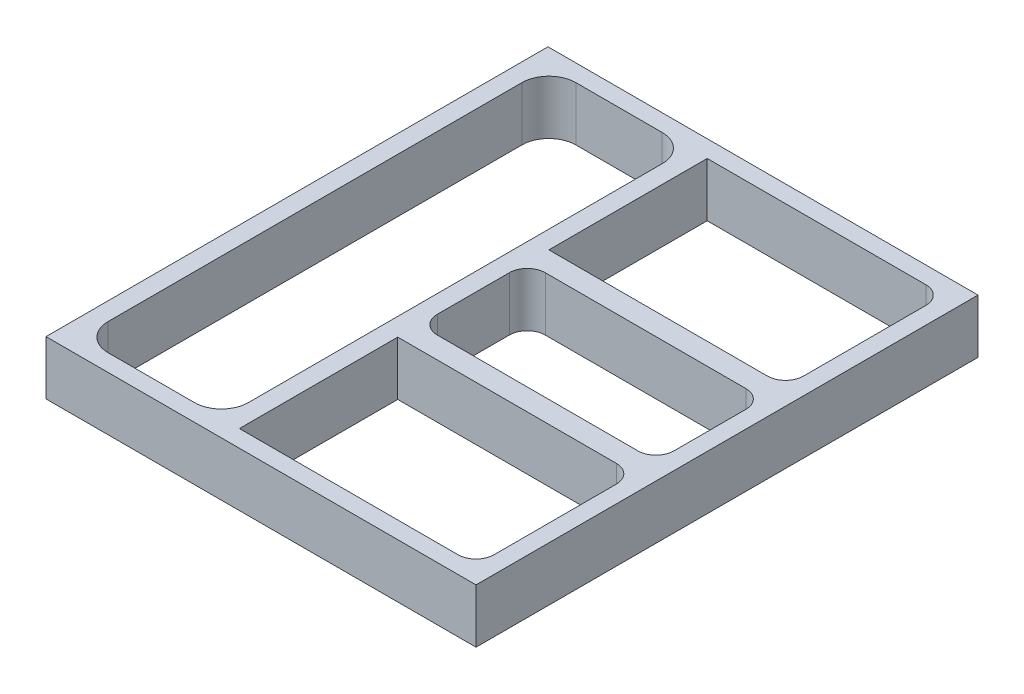
ISO-10303-21;
HEADER;
FILE_DESCRIPTION(('STEP AP214'),'2;1');
FILE_NAME('part.step','',(''),(''),'','','');
FILE_SCHEMA(('AUTOMOTIVE_DESIGN { 1 0 10303 214 1 1 1 1 }'));
ENDSEC;
DATA;
#1=APPLICATION_CONTEXT('core data for automotive mechanical design processes');
#2=APPLICATION_PROTOCOL_DEFINITION('international standard','automotive_design',2000,#1);
#3=PRODUCT_CONTEXT('',#1,'mechanical');
#4=PRODUCT('Part','Part','',(#3));
#5=PRODUCT_RELATED_PRODUCT_CATEGORY('part','',(#4));
#6=PRODUCT_DEFINITION_FORMATION('','',#4);
#7=PRODUCT_DEFINITION_CONTEXT('part definition',#1,'design');
#8=PRODUCT_DEFINITION('design','',#6,#7);
#9=PRODUCT_DEFINITION_SHAPE('','',#8);
#10=(LENGTH_UNIT() NAMED_UNIT(*) SI_UNIT(.MILLI.,.METRE.));
#11=(NAMED_UNIT(*) PLANE_ANGLE_UNIT() SI_UNIT($,.RADIAN.));
#12=(NAMED_UNIT(*) SI_UNIT($,.STERADIAN.) SOLID_ANGLE_UNIT());
#13=UNCERTAINTY_MEASURE_WITH_UNIT(LENGTH_MEASURE(1.E-05),#10,'distance_accuracy_value','');
#14=(GEOMETRIC_REPRESENTATION_CONTEXT(3) GLOBAL_UNCERTAINTY_ASSIGNED_CONTEXT((#13)) GLOBAL_UNIT_ASSIGNED_CONTEXT((#10,
#11,#12)) REPRESENTATION_CONTEXT('',''));
#15=CARTESIAN_POINT('',(0.,0.,0.));
#16=DIRECTION('',(0.,0.,1.));
#17=DIRECTION('',(1.,0.,0.));
#18=AXIS2_PLACEMENT_3D('',#15,#16,#17);
#19=CARTESIAN_POINT('',(0.,-19.685,0.));
#20=DIRECTION('',(0.,-1.,0.));
#21=DIRECTION('',(0.,0.,-1.));
#22=AXIS2_PLACEMENT_3D('',#19,#20,#21);
#23=PLANE('',#22);
#24=DIRECTION('',(1.,0.,0.));
#25=VECTOR('',#24,1.);
#26=CARTESIAN_POINT('',(-75.8825,-19.685,-88.5825));
#27=LINE('',#26,#25);
#28=CARTESIAN_POINT('',(-75.8825,-19.685,-88.5825));
#29=VERTEX_POINT('',#28);
#30=CARTESIAN_POINT('',(75.8825,-19.685,-88.5825));
#31=VERTEX_POINT('',#30);
#32=EDGE_CURVE('E456',#29,#31,#27,.T.);
#33=ORIENTED_EDGE('',*,*,#32,.T.);
#34=DIRECTION('',(0.,0.,1.));
#35=VECTOR('',#34,1.);
#36=CARTESIAN_POINT('',(75.8825,-19.685,-88.5825));
#37=LINE('',#36,#35);
#38=CARTESIAN_POINT('',(75.8825,-19.685,88.5825));
#39=VERTEX_POINT('',#38);
#40=EDGE_CURVE('E459',#31,#39,#37,.T.);
#41=ORIENTED_EDGE('',*,*,#40,.T.);
#42=DIRECTION('',(-1.,0.,0.));
#43=VECTOR('',#42,1.);
#44=CARTESIAN_POINT('',(75.8825,-19.685,88.5825));
#45=LINE('',#44,#43);
#46=CARTESIAN_POINT('',(-75.8825,-19.685,88.5825));
#47=VERTEX_POINT('',#46);
#48=EDGE_CURVE('E462',#39,#47,#45,.T.);
#49=ORIENTED_EDGE('',*,*,#48,.T.);
#50=DIRECTION('',(0.,0.,-1.));
#51=VECTOR('',#50,1.);
#52=CARTESIAN_POINT('',(-75.8825,-19.685,88.5825));
#53=LINE('',#52,#51);
#54=EDGE_CURVE('E464',#47,#29,#53,.T.);
#55=ORIENTED_EDGE('',*,*,#54,.T.);
#56=EDGE_LOOP('',(#33,#41,#49,#55));
#57=FACE_BOUND('',#56,.T.);
#58=DIRECTION('',(0.,0.,-1.));
#59=VECTOR('',#58,1.);
#60=CARTESIAN_POINT('',(-13.6525,-19.685,-26.67));
#61=LINE('',#60,#59);
#62=CARTESIAN_POINT('',(-13.6525,-19.685,-26.67));
#63=VERTEX_POINT('',#62);
#64=CARTESIAN_POINT('',(-13.6525,-19.685,-82.55));
#65=VERTEX_POINT('',#64);
#66=EDGE_CURVE('E413',#63,#65,#61,.T.);
#67=ORIENTED_EDGE('',*,*,#66,.F.);
#68=DIRECTION('',(-1.,0.,0.));
#69=VECTOR('',#68,1.);
#70=CARTESIAN_POINT('',(63.5,-19.685,-26.67));
#71=LINE('',#70,#69);
#72=CARTESIAN_POINT('',(63.5,-19.685,-26.67));
#73=VERTEX_POINT('',#72);
#74=EDGE_CURVE('E411',#73,#63,#71,.T.);
#75=ORIENTED_EDGE('',*,*,#74,.F.);
#76=CARTESIAN_POINT('',(63.5,-19.685,-33.02));
#77=DIRECTION('',(0.,-1.,0.));
#78=DIRECTION('',(0.,0.,-1.));
#79=AXIS2_PLACEMENT_3D('',#76,#77,#78);
#80=CIRCLE('',#79,6.35);
#81=CARTESIAN_POINT('',(69.85,-19.685,-33.02));
#82=VERTEX_POINT('',#81);
#83=EDGE_CURVE('E423',#82,#73,#80,.T.);
#84=ORIENTED_EDGE('',*,*,#83,.F.);
#85=DIRECTION('',(0.,0.,1.));
#86=VECTOR('',#85,1.);
#87=CARTESIAN_POINT('',(69.85,-19.685,-76.2));
#88=LINE('',#87,#86);
#89=CARTESIAN_POINT('',(69.85,-19.685,-76.2));
#90=VERTEX_POINT('',#89);
#91=EDGE_CURVE('E420',#90,#82,#88,.T.);
#92=ORIENTED_EDGE('',*,*,#91,.F.);
#93=CARTESIAN_POINT('',(63.5,-19.685,-76.2));
#94=DIRECTION('',(0.,-1.,0.));
#95=DIRECTION('',(0.,0.,-1.));
#96=AXIS2_PLACEMENT_3D('',#93,#94,#95);
#97=CIRCLE('',#96,6.34999999999999);
#98=CARTESIAN_POINT('',(63.5,-19.685,-82.55));
#99=VERTEX_POINT('',#98);
#100=EDGE_CURVE('E418',#99,#90,#97,.T.);
#101=ORIENTED_EDGE('',*,*,#100,.F.);
#102=DIRECTION('',(1.,0.,0.));
#103=VECTOR('',#102,1.);
#104=CARTESIAN_POINT('',(-13.6525,-19.685,-82.55));
#105=LINE('',#104,#103);
#106=EDGE_CURVE('E416',#65,#99,#105,.T.);
#107=ORIENTED_EDGE('',*,*,#106,.F.);
#108=EDGE_LOOP('',(#67,#75,#84,#92,#101,#107));
#109=FACE_BOUND('',#108,.T.);
#110=DIRECTION('',(0.,0.,-1.));
#111=VECTOR('',#110,1.);
#112=CARTESIAN_POINT('',(-13.6525,-19.685,82.55));
#113=LINE('',#112,#111);
#114=CARTESIAN_POINT('',(-13.6525,-19.685,82.55));
#115=VERTEX_POINT('',#114);
#116=CARTESIAN_POINT('',(-13.6525,-19.685,26.67));
#117=VERTEX_POINT('',#116);
#118=EDGE_CURVE('E368',#115,#117,#113,.T.);
#119=ORIENTED_EDGE('',*,*,#118,.F.);
#120=DIRECTION('',(-1.,0.,0.));
#121=VECTOR('',#120,1.);
#122=CARTESIAN_POINT('',(63.4999999999999,-19.685,82.55));
#123=LINE('',#122,#121);
#124=CARTESIAN_POINT('',(63.4999999999999,-19.685,82.55));
#125=VERTEX_POINT('',#124);
#126=EDGE_CURVE('E366',#125,#115,#123,.T.);
#127=ORIENTED_EDGE('',*,*,#126,.F.);
#128=CARTESIAN_POINT('',(63.4999999999999,-19.685,76.2));
#129=DIRECTION('',(0.,-1.,0.));
#130=DIRECTION('',(0.,0.,-1.));
#131=AXIS2_PLACEMENT_3D('',#128,#129,#130);
#132=CIRCLE('',#131,6.34999999999999);
#133=CARTESIAN_POINT('',(69.8499999999999,-19.685,76.2));
#134=VERTEX_POINT('',#133);
#135=EDGE_CURVE('E378',#134,#125,#132,.T.);
#136=ORIENTED_EDGE('',*,*,#135,.F.);
#137=DIRECTION('',(0.,0.,1.));
#138=VECTOR('',#137,1.);
#139=CARTESIAN_POINT('',(69.85,-19.685,33.02));
#140=LINE('',#139,#138);
#141=CARTESIAN_POINT('',(69.85,-19.685,33.02));
#142=VERTEX_POINT('',#141);
#143=EDGE_CURVE('E375',#142,#134,#140,.T.);
#144=ORIENTED_EDGE('',*,*,#143,.F.);
#145=CARTESIAN_POINT('',(63.5,-19.685,33.02));
#146=DIRECTION('',(0.,-1.,0.));
#147=DIRECTION('',(0.,0.,-1.));
#148=AXIS2_PLACEMENT_3D('',#145,#146,#147);
#149=CIRCLE('',#148,6.34999999999999);
#150=CARTESIAN_POINT('',(63.5,-19.685,26.67));
#151=VERTEX_POINT('',#150);
#152=EDGE_CURVE('E373',#151,#142,#149,.T.);
#153=ORIENTED_EDGE('',*,*,#152,.F.);
#154=DIRECTION('',(1.,0.,0.));
#155=VECTOR('',#154,1.);
#156=CARTESIAN_POINT('',(-13.6525,-19.685,26.67));
#157=LINE('',#156,#155);
#158=EDGE_CURVE('E371',#117,#151,#157,.T.);
#159=ORIENTED_EDGE('',*,*,#158,.F.);
#160=EDGE_LOOP('',(#119,#127,#136,#144,#153,#159));
#161=FACE_BOUND('',#160,.T.);
#162=DIRECTION('',(1.,0.,0.));
#163=VECTOR('',#162,1.);
#164=CARTESIAN_POINT('',(-7.30250000000001,-19.685,-19.05));
#165=LINE('',#164,#163);
#166=CARTESIAN_POINT('',(-7.30250000000001,-19.685,-19.05));
#167=VERTEX_POINT('',#166);
#168=CARTESIAN_POINT('',(63.5,-19.685,-19.05));
#169=VERTEX_POINT('',#168);
#170=EDGE_CURVE('E309',#167,#169,#165,.T.);
#171=ORIENTED_EDGE('',*,*,#170,.F.);
#172=CARTESIAN_POINT('',(-7.30250000000001,-19.685,-12.7));
#173=DIRECTION('',(0.,-1.,0.));
#174=DIRECTION('',(0.,0.,-1.));
#175=AXIS2_PLACEMENT_3D('',#172,#173,#174);
#176=CIRCLE('',#175,6.35);
#177=CARTESIAN_POINT('',(-13.6525,-19.685,-12.7));
#178=VERTEX_POINT('',#177);
#179=EDGE_CURVE('E307',#178,#167,#176,.T.);
#180=ORIENTED_EDGE('',*,*,#179,.F.);
#181=DIRECTION('',(0.,0.,-1.));
#182=VECTOR('',#181,1.);
#183=CARTESIAN_POINT('',(-13.6525,-19.685,12.7));
#184=LINE('',#183,#182);
#185=CARTESIAN_POINT('',(-13.6525,-19.685,12.7));
#186=VERTEX_POINT('',#185);
#187=EDGE_CURVE('E323',#186,#178,#184,.T.);
#188=ORIENTED_EDGE('',*,*,#187,.F.);
#189=CARTESIAN_POINT('',(-7.30250000000001,-19.685,12.7));
#190=DIRECTION('',(0.,-1.,0.));
#191=DIRECTION('',(0.,0.,-1.));
#192=AXIS2_PLACEMENT_3D('',#189,#190,#191);
#193=CIRCLE('',#192,6.35);
#194=CARTESIAN_POINT('',(-7.30250000000001,-19.685,19.05));
#195=VERTEX_POINT('',#194);
#196=EDGE_CURVE('E320',#195,#186,#193,.T.);
#197=ORIENTED_EDGE('',*,*,#196,.F.);
#198=DIRECTION('',(-1.,0.,0.));
#199=VECTOR('',#198,1.);
#200=CARTESIAN_POINT('',(-7.30250000000001,-19.685,19.05));
#201=LINE('',#200,#199);
#202=CARTESIAN_POINT('',(63.5,-19.685,19.05));
#203=VERTEX_POINT('',#202);
#204=EDGE_CURVE('E318',#203,#195,#201,.T.);
#205=ORIENTED_EDGE('',*,*,#204,.F.);
#206=CARTESIAN_POINT('',(63.5,-19.685,12.7));
#207=DIRECTION('',(0.,-1.,0.));
#208=DIRECTION('',(0.,0.,1.));
#209=AXIS2_PLACEMENT_3D('',#206,#207,#208);
#210=CIRCLE('',#209,6.35);
#211=CARTESIAN_POINT('',(69.85,-19.685,12.7));
#212=VERTEX_POINT('',#211);
#213=EDGE_CURVE('E316',#212,#203,#210,.T.);
#214=ORIENTED_EDGE('',*,*,#213,.F.);
#215=DIRECTION('',(0.,0.,1.));
#216=VECTOR('',#215,1.);
#217=CARTESIAN_POINT('',(69.85,-19.685,12.7));
#218=LINE('',#217,#216);
#219=CARTESIAN_POINT('',(69.85,-19.685,-12.7));
#220=VERTEX_POINT('',#219);
#221=EDGE_CURVE('E314',#220,#212,#218,.T.);
#222=ORIENTED_EDGE('',*,*,#221,.F.);
#223=CARTESIAN_POINT('',(63.5,-19.685,-12.7));
#224=DIRECTION('',(0.,-1.,0.));
#225=DIRECTION('',(0.,0.,-1.));
#226=AXIS2_PLACEMENT_3D('',#223,#224,#225);
#227=CIRCLE('',#226,6.35);
#228=EDGE_CURVE('E312',#169,#220,#227,.T.);
#229=ORIENTED_EDGE('',*,*,#228,.F.);
#230=EDGE_LOOP('',(#171,#180,#188,#197,#205,#214,#222,#229));
#231=FACE_BOUND('',#230,.T.);
#232=DIRECTION('',(0.,0.,1.));
#233=VECTOR('',#232,1.);
#234=CARTESIAN_POINT('',(-20.0025,-19.685,73.025));
#235=LINE('',#234,#233);
#236=CARTESIAN_POINT('',(-20.0025,-19.685,-73.025));
#237=VERTEX_POINT('',#236);
#238=CARTESIAN_POINT('',(-20.0025,-19.685,73.025));
#239=VERTEX_POINT('',#238);
#240=EDGE_CURVE('E250',#237,#239,#235,.T.);
#241=ORIENTED_EDGE('',*,*,#240,.F.);
#242=CARTESIAN_POINT('',(-29.5275,-19.685,-73.025));
#243=DIRECTION('',(0.,-1.,0.));
#244=DIRECTION('',(0.,0.,1.));
#245=AXIS2_PLACEMENT_3D('',#242,#243,#244);
#246=CIRCLE('',#245,9.525);
#247=CARTESIAN_POINT('',(-29.5275,-19.685,-82.55));
#248=VERTEX_POINT('',#247);
#249=EDGE_CURVE('E242',#248,#237,#246,.T.);
#250=ORIENTED_EDGE('',*,*,#249,.F.);
#251=DIRECTION('',(1.,0.,0.));
#252=VECTOR('',#251,1.);
#253=CARTESIAN_POINT('',(-29.5275,-19.685,-82.55));
#254=LINE('',#253,#252);
#255=CARTESIAN_POINT('',(-60.0075,-19.685,-82.55));
#256=VERTEX_POINT('',#255);
#257=EDGE_CURVE('E275',#256,#248,#254,.T.);
#258=ORIENTED_EDGE('',*,*,#257,.F.);
#259=CARTESIAN_POINT('',(-60.0075,-19.685,-73.025));
#260=DIRECTION('',(0.,-1.,0.));
#261=DIRECTION('',(0.,0.,1.));
#262=AXIS2_PLACEMENT_3D('',#259,#260,#261);
#263=CIRCLE('',#262,9.525);
#264=CARTESIAN_POINT('',(-69.5325,-19.685,-73.025));
#265=VERTEX_POINT('',#264);
#266=EDGE_CURVE('E273',#265,#256,#263,.T.);
#267=ORIENTED_EDGE('',*,*,#266,.F.);
#268=DIRECTION('',(0.,0.,-1.));
#269=VECTOR('',#268,1.);
#270=CARTESIAN_POINT('',(-69.5325,-19.685,73.025));
#271=LINE('',#270,#269);
#272=CARTESIAN_POINT('',(-69.5325,-19.685,73.025));
#273=VERTEX_POINT('',#272);
#274=EDGE_CURVE('E271',#273,#265,#271,.T.);
#275=ORIENTED_EDGE('',*,*,#274,.F.);
#276=CARTESIAN_POINT('',(-60.0075,-19.685,73.025));
#277=DIRECTION('',(0.,-1.,0.));
#278=DIRECTION('',(0.,0.,-1.));
#279=AXIS2_PLACEMENT_3D('',#276,#277,#278);
#280=CIRCLE('',#279,9.525);
#281=CARTESIAN_POINT('',(-60.0075,-19.685,82.55));
#282=VERTEX_POINT('',#281);
#283=EDGE_CURVE('E269',#282,#273,#280,.T.);
#284=ORIENTED_EDGE('',*,*,#283,.F.);
#285=DIRECTION('',(-1.,0.,0.));
#286=VECTOR('',#285,1.);
#287=CARTESIAN_POINT('',(-29.5275,-19.685,82.55));
#288=LINE('',#287,#286);
#289=CARTESIAN_POINT('',(-29.5275,-19.685,82.55));
#290=VERTEX_POINT('',#289);
#291=EDGE_CURVE('E265',#290,#282,#288,.T.);
#292=ORIENTED_EDGE('',*,*,#291,.F.);
#293=CARTESIAN_POINT('',(-29.5275,-19.685,73.025));
#294=DIRECTION('',(0.,-1.,0.));
#295=DIRECTION('',(0.,0.,1.));
#296=AXIS2_PLACEMENT_3D('',#293,#294,#295);
#297=CIRCLE('',#296,9.525);
#298=EDGE_CURVE('E263',#239,#290,#297,.T.);
#299=ORIENTED_EDGE('',*,*,#298,.F.);
#300=EDGE_LOOP('',(#241,#250,#258,#267,#275,#284,#292,#299));
#301=FACE_BOUND('',#300,.T.);
#302=ADVANCED_FACE('F33',(#57,#109,#161,#231,#301),#23,.T.);
#303=CARTESIAN_POINT('',(0.,-0.635,0.));
#304=DIRECTION('',(0.,-1.,0.));
#305=DIRECTION('',(0.,0.,-1.));
#306=AXIS2_PLACEMENT_3D('',#303,#304,#305);
#307=PLANE('',#306);
#308=CARTESIAN_POINT('',(-7.30250000000001,-0.635,-12.7));
#309=DIRECTION('',(0.,-1.,0.));
#310=DIRECTION('',(0.,0.,-1.));
#311=AXIS2_PLACEMENT_3D('',#308,#309,#310);
#312=CIRCLE('',#311,6.35);
#313=CARTESIAN_POINT('',(-13.6525,-0.635,-12.7));
#314=VERTEX_POINT('',#313);
#315=CARTESIAN_POINT('',(-7.30250000000001,-0.635,-19.05));
#316=VERTEX_POINT('',#315);
#317=EDGE_CURVE('E258',#314,#316,#312,.T.);
#318=ORIENTED_EDGE('',*,*,#317,.T.);
#319=DIRECTION('',(1.,0.,0.));
#320=VECTOR('',#319,1.);
#321=CARTESIAN_POINT('',(-7.30250000000001,-0.635,-19.05));
#322=LINE('',#321,#320);
#323=CARTESIAN_POINT('',(63.5,-0.635,-19.05));
#324=VERTEX_POINT('',#323);
#325=EDGE_CURVE('E328',#316,#324,#322,.T.);
#326=ORIENTED_EDGE('',*,*,#325,.T.);
#327=CARTESIAN_POINT('',(63.5,-0.635,-12.7));
#328=DIRECTION('',(0.,-1.,0.));
#329=DIRECTION('',(0.,0.,-1.));
#330=AXIS2_PLACEMENT_3D('',#327,#328,#329);
#331=CIRCLE('',#330,6.35);
#332=CARTESIAN_POINT('',(69.85,-0.635,-12.7));
#333=VERTEX_POINT('',#332);
#334=EDGE_CURVE('E331',#324,#333,#331,.T.);
#335=ORIENTED_EDGE('',*,*,#334,.T.);
#336=DIRECTION('',(0.,0.,1.));
#337=VECTOR('',#336,1.);
#338=CARTESIAN_POINT('',(69.85,-0.635,12.7));
#339=LINE('',#338,#337);
#340=CARTESIAN_POINT('',(69.85,-0.635,12.7));
#341=VERTEX_POINT('',#340);
#342=EDGE_CURVE('E334',#333,#341,#339,.T.);
#343=ORIENTED_EDGE('',*,*,#342,.T.);
#344=CARTESIAN_POINT('',(63.5,-0.635,12.7));
#345=DIRECTION('',(0.,-1.,0.));
#346=DIRECTION('',(0.,0.,1.));
#347=AXIS2_PLACEMENT_3D('',#344,#345,#346);
#348=CIRCLE('',#347,6.35);
#349=CARTESIAN_POINT('',(63.5,-0.635,19.05));
#350=VERTEX_POINT('',#349);
#351=EDGE_CURVE('E337',#341,#350,#348,.T.);
#352=ORIENTED_EDGE('',*,*,#351,.T.);
#353=DIRECTION('',(-1.,0.,0.));
#354=VECTOR('',#353,1.);
#355=CARTESIAN_POINT('',(-7.30250000000001,-0.635,19.05));
#356=LINE('',#355,#354);
#357=CARTESIAN_POINT('',(-7.30250000000001,-0.635,19.05));
#358=VERTEX_POINT('',#357);
#359=EDGE_CURVE('E340',#350,#358,#356,.T.);
#360=ORIENTED_EDGE('',*,*,#359,.T.);
#361=CARTESIAN_POINT('',(-7.30250000000001,-0.635,12.7));
#362=DIRECTION('',(0.,-1.,0.));
#363=DIRECTION('',(0.,0.,-1.));
#364=AXIS2_PLACEMENT_3D('',#361,#362,#363);
#365=CIRCLE('',#364,6.35);
#366=CARTESIAN_POINT('',(-13.6525,-0.635,12.7));
#367=VERTEX_POINT('',#366);
#368=EDGE_CURVE('E343',#358,#367,#365,.T.);
#369=ORIENTED_EDGE('',*,*,#368,.T.);
#370=DIRECTION('',(0.,0.,-1.));
#371=VECTOR('',#370,1.);
#372=CARTESIAN_POINT('',(-13.6525,-0.635,12.7));
#373=LINE('',#372,#371);
#374=EDGE_CURVE('E310',#367,#314,#373,.T.);
#375=ORIENTED_EDGE('',*,*,#374,.T.);
#376=EDGE_LOOP('',(#318,#326,#335,#343,#352,#360,#369,#375));
#377=FACE_BOUND('',#376,.T.);
#378=DIRECTION('',(-1.,0.,0.));
#379=VECTOR('',#378,1.);
#380=CARTESIAN_POINT('',(63.5,-0.635,-26.67));
#381=LINE('',#380,#379);
#382=CARTESIAN_POINT('',(63.5,-0.635,-26.67));
#383=VERTEX_POINT('',#382);
#384=CARTESIAN_POINT('',(-13.6525,-0.635,-26.67));
#385=VERTEX_POINT('',#384);
#386=EDGE_CURVE('E410',#383,#385,#381,.T.);
#387=ORIENTED_EDGE('',*,*,#386,.T.);
#388=DIRECTION('',(0.,0.,-1.));
#389=VECTOR('',#388,1.);
#390=CARTESIAN_POINT('',(-13.6525,-0.635,-26.67));
#391=LINE('',#390,#389);
#392=CARTESIAN_POINT('',(-13.6525,-0.635,-82.55));
#393=VERTEX_POINT('',#392);
#394=EDGE_CURVE('E428',#385,#393,#391,.T.);
#395=ORIENTED_EDGE('',*,*,#394,.T.);
#396=DIRECTION('',(1.,0.,0.));
#397=VECTOR('',#396,1.);
#398=CARTESIAN_POINT('',(-13.6525,-0.635,-82.55));
#399=LINE('',#398,#397);
#400=CARTESIAN_POINT('',(63.5,-0.635,-82.55));
#401=VERTEX_POINT('',#400);
#402=EDGE_CURVE('E431',#393,#401,#399,.T.);
#403=ORIENTED_EDGE('',*,*,#402,.T.);
#404=CARTESIAN_POINT('',(63.5,-0.635,-76.2));
#405=DIRECTION('',(0.,-1.,0.));
#406=DIRECTION('',(0.,0.,-1.));
#407=AXIS2_PLACEMENT_3D('',#404,#405,#406);
#408=CIRCLE('',#407,6.34999999999999);
#409=CARTESIAN_POINT('',(69.85,-0.635,-76.2));
#410=VERTEX_POINT('',#409);
#411=EDGE_CURVE('E434',#401,#410,#408,.T.);
#412=ORIENTED_EDGE('',*,*,#411,.T.);
#413=DIRECTION('',(0.,0.,1.));
#414=VECTOR('',#413,1.);
#415=CARTESIAN_POINT('',(69.85,-0.635,-76.2));
#416=LINE('',#415,#414);
#417=CARTESIAN_POINT('',(69.85,-0.635,-33.02));
#418=VERTEX_POINT('',#417);
#419=EDGE_CURVE('E437',#410,#418,#416,.T.);
#420=ORIENTED_EDGE('',*,*,#419,.T.);
#421=CARTESIAN_POINT('',(63.5,-0.635,-33.02));
#422=DIRECTION('',(0.,-1.,0.));
#423=DIRECTION('',(0.,0.,-1.));
#424=AXIS2_PLACEMENT_3D('',#421,#422,#423);
#425=CIRCLE('',#424,6.35);
#426=EDGE_CURVE('E414',#418,#383,#425,.T.);
#427=ORIENTED_EDGE('',*,*,#426,.T.);
#428=EDGE_LOOP('',(#387,#395,#403,#412,#420,#427));
#429=FACE_BOUND('',#428,.T.);
#430=DIRECTION('',(1.,0.,0.));
#431=VECTOR('',#430,1.);
#432=CARTESIAN_POINT('',(-75.8825,-0.635,-88.5825));
#433=LINE('',#432,#431);
#434=CARTESIAN_POINT('',(-75.8825,-0.635,-88.5825));
#435=VERTEX_POINT('',#434);
#436=CARTESIAN_POINT('',(75.8825,-0.635,-88.5825));
#437=VERTEX_POINT('',#436);
#438=EDGE_CURVE('E455',#435,#437,#433,.T.);
#439=ORIENTED_EDGE('',*,*,#438,.F.);
#440=DIRECTION('',(0.,0.,-1.));
#441=VECTOR('',#440,1.);
#442=CARTESIAN_POINT('',(-75.8825,-0.635,88.5825));
#443=LINE('',#442,#441);
#444=CARTESIAN_POINT('',(-75.8825,-0.635,88.5825));
#445=VERTEX_POINT('',#444);
#446=EDGE_CURVE('E460',#445,#435,#443,.T.);
#447=ORIENTED_EDGE('',*,*,#446,.F.);
#448=DIRECTION('',(-1.,0.,0.));
#449=VECTOR('',#448,1.);
#450=CARTESIAN_POINT('',(75.8825,-0.635,88.5825));
#451=LINE('',#450,#449);
#452=CARTESIAN_POINT('',(75.8825,-0.635,88.5825));
#453=VERTEX_POINT('',#452);
#454=EDGE_CURVE('E471',#453,#445,#451,.T.);
#455=ORIENTED_EDGE('',*,*,#454,.F.);
#456=DIRECTION('',(0.,0.,1.));
#457=VECTOR('',#456,1.);
#458=CARTESIAN_POINT('',(75.8825,-0.635,-88.5825));
#459=LINE('',#458,#457);
#460=EDGE_CURVE('E469',#437,#453,#459,.T.);
#461=ORIENTED_EDGE('',*,*,#460,.F.);
#462=EDGE_LOOP('',(#439,#447,#455,#461));
#463=FACE_BOUND('',#462,.T.);
#464=DIRECTION('',(-1.,0.,0.));
#465=VECTOR('',#464,1.);
#466=CARTESIAN_POINT('',(63.4999999999999,-0.635,82.55));
#467=LINE('',#466,#465);
#468=CARTESIAN_POINT('',(63.4999999999999,-0.635,82.55));
#469=VERTEX_POINT('',#468);
#470=CARTESIAN_POINT('',(-13.6525,-0.635,82.55));
#471=VERTEX_POINT('',#470);
#472=EDGE_CURVE('E365',#469,#471,#467,.T.);
#473=ORIENTED_EDGE('',*,*,#472,.T.);
#474=DIRECTION('',(0.,0.,-1.));
#475=VECTOR('',#474,1.);
#476=CARTESIAN_POINT('',(-13.6525,-0.635,82.55));
#477=LINE('',#476,#475);
#478=CARTESIAN_POINT('',(-13.6525,-0.635,26.67));
#479=VERTEX_POINT('',#478);
#480=EDGE_CURVE('E383',#471,#479,#477,.T.);
#481=ORIENTED_EDGE('',*,*,#480,.T.);
#482=DIRECTION('',(1.,0.,0.));
#483=VECTOR('',#482,1.);
#484=CARTESIAN_POINT('',(-13.6525,-0.635,26.67));
#485=LINE('',#484,#483);
#486=CARTESIAN_POINT('',(63.5,-0.635,26.67));
#487=VERTEX_POINT('',#486);
#488=EDGE_CURVE('E386',#479,#487,#485,.T.);
#489=ORIENTED_EDGE('',*,*,#488,.T.);
#490=CARTESIAN_POINT('',(63.5,-0.635,33.02));
#491=DIRECTION('',(0.,-1.,0.));
#492=DIRECTION('',(0.,0.,-1.));
#493=AXIS2_PLACEMENT_3D('',#490,#491,#492);
#494=CIRCLE('',#493,6.34999999999999);
#495=CARTESIAN_POINT('',(69.85,-0.635,33.02));
#496=VERTEX_POINT('',#495);
#497=EDGE_CURVE('E389',#487,#496,#494,.T.);
#498=ORIENTED_EDGE('',*,*,#497,.T.);
#499=DIRECTION('',(0.,0.,1.));
#500=VECTOR('',#499,1.);
#501=CARTESIAN_POINT('',(69.85,-0.635,33.02));
#502=LINE('',#501,#500);
#503=CARTESIAN_POINT('',(69.85,-0.635,76.2));
#504=VERTEX_POINT('',#503);
#505=EDGE_CURVE('E392',#496,#504,#502,.T.);
#506=ORIENTED_EDGE('',*,*,#505,.T.);
#507=CARTESIAN_POINT('',(63.4999999999999,-0.635,76.2));
#508=DIRECTION('',(0.,-1.,0.));
#509=DIRECTION('',(0.,0.,-1.));
#510=AXIS2_PLACEMENT_3D('',#507,#508,#509);
#511=CIRCLE('',#510,6.34999999999999);
#512=EDGE_CURVE('E369',#504,#469,#511,.T.);
#513=ORIENTED_EDGE('',*,*,#512,.T.);
#514=EDGE_LOOP('',(#473,#481,#489,#498,#506,#513));
#515=FACE_BOUND('',#514,.T.);
#516=CARTESIAN_POINT('',(-29.5275,-0.635,-73.025));
#517=DIRECTION('',(0.,-1.,0.));
#518=DIRECTION('',(0.,0.,1.));
#519=AXIS2_PLACEMENT_3D('',#516,#517,#518);
#520=CIRCLE('',#519,9.525);
#521=CARTESIAN_POINT('',(-29.5275,-0.635,-82.55));
#522=VERTEX_POINT('',#521);
#523=CARTESIAN_POINT('',(-20.0025,-0.635,-73.025));
#524=VERTEX_POINT('',#523);
#525=EDGE_CURVE('E56',#522,#524,#520,.T.);
#526=ORIENTED_EDGE('',*,*,#525,.T.);
#527=DIRECTION('',(0.,0.,1.));
#528=VECTOR('',#527,1.);
#529=CARTESIAN_POINT('',(-20.0025,-0.635,73.025));
#530=LINE('',#529,#528);
#531=CARTESIAN_POINT('',(-20.0025,-0.635,73.025));
#532=VERTEX_POINT('',#531);
#533=EDGE_CURVE('E257',#524,#532,#530,.T.);
#534=ORIENTED_EDGE('',*,*,#533,.T.);
#535=CARTESIAN_POINT('',(-29.5275,-0.635,73.025));
#536=DIRECTION('',(0.,-1.,0.));
#537=DIRECTION('',(0.,0.,1.));
#538=AXIS2_PLACEMENT_3D('',#535,#536,#537);
#539=CIRCLE('',#538,9.525);
#540=CARTESIAN_POINT('',(-29.5275,-0.635,82.55));
#541=VERTEX_POINT('',#540);
#542=EDGE_CURVE('E279',#532,#541,#539,.T.);
#543=ORIENTED_EDGE('',*,*,#542,.T.);
#544=DIRECTION('',(-1.,0.,0.));
#545=VECTOR('',#544,1.);
#546=CARTESIAN_POINT('',(-29.5275,-0.635,82.55));
#547=LINE('',#546,#545);
#548=CARTESIAN_POINT('',(-60.0075,-0.635,82.55));
#549=VERTEX_POINT('',#548);
#550=EDGE_CURVE('E282',#541,#549,#547,.T.);
#551=ORIENTED_EDGE('',*,*,#550,.T.);
#552=CARTESIAN_POINT('',(-60.0075,-0.635,73.025));
#553=DIRECTION('',(0.,-1.,0.));
#554=DIRECTION('',(0.,0.,-1.));
#555=AXIS2_PLACEMENT_3D('',#552,#553,#554);
#556=CIRCLE('',#555,9.525);
#557=CARTESIAN_POINT('',(-69.5325,-0.635,73.025));
#558=VERTEX_POINT('',#557);
#559=EDGE_CURVE('E285',#549,#558,#556,.T.);
#560=ORIENTED_EDGE('',*,*,#559,.T.);
#561=DIRECTION('',(0.,0.,-1.));
#562=VECTOR('',#561,1.);
#563=CARTESIAN_POINT('',(-69.5325,-0.635,73.025));
#564=LINE('',#563,#562);
#565=CARTESIAN_POINT('',(-69.5325,-0.635,-73.025));
#566=VERTEX_POINT('',#565);
#567=EDGE_CURVE('E288',#558,#566,#564,.T.);
#568=ORIENTED_EDGE('',*,*,#567,.T.);
#569=CARTESIAN_POINT('',(-60.0075,-0.635,-73.025));
#570=DIRECTION('',(0.,-1.,0.));
#571=DIRECTION('',(0.,0.,1.));
#572=AXIS2_PLACEMENT_3D('',#569,#570,#571);
#573=CIRCLE('',#572,9.525);
#574=CARTESIAN_POINT('',(-60.0075,-0.635,-82.55));
#575=VERTEX_POINT('',#574);
#576=EDGE_CURVE('E291',#566,#575,#573,.T.);
#577=ORIENTED_EDGE('',*,*,#576,.T.);
#578=DIRECTION('',(1.,0.,0.));
#579=VECTOR('',#578,1.);
#580=CARTESIAN_POINT('',(-29.5275,-0.635,-82.55));
#581=LINE('',#580,#579);
#582=EDGE_CURVE('E251',#575,#522,#581,.T.);
#583=ORIENTED_EDGE('',*,*,#582,.T.);
#584=EDGE_LOOP('',(#526,#534,#543,#551,#560,#568,#577,#583));
#585=FACE_BOUND('',#584,.T.);
#586=ADVANCED_FACE('F489',(#377,#429,#463,#515,#585),#307,.F.);
#587=CARTESIAN_POINT('',(-75.8825,-19.685,-88.5825));
#588=DIRECTION('',(0.,0.,1.));
#589=DIRECTION('',(1.,0.,0.));
#590=AXIS2_PLACEMENT_3D('',#587,#588,#589);
#591=PLANE('',#590);
#592=ORIENTED_EDGE('',*,*,#438,.T.);
#593=DIRECTION('',(0.,1.,0.));
#594=VECTOR('',#593,1.);
#595=CARTESIAN_POINT('',(75.8825,-19.685,-88.5825));
#596=LINE('',#595,#594);
#597=EDGE_CURVE('E11',#31,#437,#596,.T.);
#598=ORIENTED_EDGE('',*,*,#597,.F.);
#599=ORIENTED_EDGE('',*,*,#32,.F.);
#600=DIRECTION('',(0.,1.,0.));
#601=VECTOR('',#600,1.);
#602=CARTESIAN_POINT('',(-75.8825,-19.685,-88.5825));
#603=LINE('',#602,#601);
#604=EDGE_CURVE('E466',#29,#435,#603,.T.);
#605=ORIENTED_EDGE('',*,*,#604,.T.);
#606=EDGE_LOOP('',(#592,#598,#599,#605));
#607=FACE_BOUND('',#606,.T.);
#608=ADVANCED_FACE('F35',(#607),#591,.F.);
#609=CARTESIAN_POINT('',(75.8825,-19.685,-88.5825));
#610=DIRECTION('',(-1.,0.,0.));
#611=DIRECTION('',(0.,0.,1.));
#612=AXIS2_PLACEMENT_3D('',#609,#610,#611);
#613=PLANE('',#612);
#614=ORIENTED_EDGE('',*,*,#460,.T.);
#615=DIRECTION('',(0.,1.,0.));
#616=VECTOR('',#615,1.);
#617=CARTESIAN_POINT('',(75.8825,-19.685,88.5825));
#618=LINE('',#617,#616);
#619=EDGE_CURVE('E41',#39,#453,#618,.T.);
#620=ORIENTED_EDGE('',*,*,#619,.F.);
#621=ORIENTED_EDGE('',*,*,#40,.F.);
#622=ORIENTED_EDGE('',*,*,#597,.T.);
#623=EDGE_LOOP('',(#614,#620,#621,#622));
#624=FACE_BOUND('',#623,.T.);
#625=ADVANCED_FACE('F500',(#624),#613,.F.);
#626=CARTESIAN_POINT('',(75.8825,-19.685,88.5825));
#627=DIRECTION('',(0.,0.,-1.));
#628=DIRECTION('',(-1.,0.,0.));
#629=AXIS2_PLACEMENT_3D('',#626,#627,#628);
#630=PLANE('',#629);
#631=ORIENTED_EDGE('',*,*,#454,.T.);
#632=DIRECTION('',(0.,1.,0.));
#633=VECTOR('',#632,1.);
#634=CARTESIAN_POINT('',(-75.8825,-19.685,88.5825));
#635=LINE('',#634,#633);
#636=EDGE_CURVE('E476',#47,#445,#635,.T.);
#637=ORIENTED_EDGE('',*,*,#636,.F.);
#638=ORIENTED_EDGE('',*,*,#48,.F.);
#639=ORIENTED_EDGE('',*,*,#619,.T.);
#640=EDGE_LOOP('',(#631,#637,#638,#639));
#641=FACE_BOUND('',#640,.T.);
#642=ADVANCED_FACE('F483',(#641),#630,.F.);
#643=CARTESIAN_POINT('',(-75.8825,-19.685,88.5825));
#644=DIRECTION('',(1.,0.,0.));
#645=DIRECTION('',(0.,0.,-1.));
#646=AXIS2_PLACEMENT_3D('',#643,#644,#645);
#647=PLANE('',#646);
#648=ORIENTED_EDGE('',*,*,#446,.T.);
#649=ORIENTED_EDGE('',*,*,#604,.F.);
#650=ORIENTED_EDGE('',*,*,#54,.F.);
#651=ORIENTED_EDGE('',*,*,#636,.T.);
#652=EDGE_LOOP('',(#648,#649,#650,#651));
#653=FACE_BOUND('',#652,.T.);
#654=ADVANCED_FACE('F493',(#653),#647,.F.);
#655=CARTESIAN_POINT('',(63.5,-19.685,-26.67));
#656=DIRECTION('',(0.,0.,-1.));
#657=DIRECTION('',(-1.,0.,0.));
#658=AXIS2_PLACEMENT_3D('',#655,#656,#657);
#659=PLANE('',#658);
#660=ORIENTED_EDGE('',*,*,#386,.F.);
#661=DIRECTION('',(0.,1.,0.));
#662=VECTOR('',#661,1.);
#663=CARTESIAN_POINT('',(63.5,-19.685,-26.67));
#664=LINE('',#663,#662);
#665=EDGE_CURVE('E425',#73,#383,#664,.T.);
#666=ORIENTED_EDGE('',*,*,#665,.F.);
#667=ORIENTED_EDGE('',*,*,#74,.T.);
#668=DIRECTION('',(0.,1.,0.));
#669=VECTOR('',#668,1.);
#670=CARTESIAN_POINT('',(-13.6525,-19.685,-26.67));
#671=LINE('',#670,#669);
#672=EDGE_CURVE('E452',#63,#385,#671,.T.);
#673=ORIENTED_EDGE('',*,*,#672,.T.);
#674=EDGE_LOOP('',(#660,#666,#667,#673));
#675=FACE_BOUND('',#674,.T.);
#676=ADVANCED_FACE('F515',(#675),#659,.T.);
#677=CARTESIAN_POINT('',(-13.6525,-19.685,-26.67));
#678=DIRECTION('',(1.,0.,0.));
#679=DIRECTION('',(0.,0.,-1.));
#680=AXIS2_PLACEMENT_3D('',#677,#678,#679);
#681=PLANE('',#680);
#682=ORIENTED_EDGE('',*,*,#394,.F.);
#683=ORIENTED_EDGE('',*,*,#672,.F.);
#684=ORIENTED_EDGE('',*,*,#66,.T.);
#685=DIRECTION('',(0.,1.,0.));
#686=VECTOR('',#685,1.);
#687=CARTESIAN_POINT('',(-13.6525,-19.685,-82.55));
#688=LINE('',#687,#686);
#689=EDGE_CURVE('E450',#65,#393,#688,.T.);
#690=ORIENTED_EDGE('',*,*,#689,.T.);
#691=EDGE_LOOP('',(#682,#683,#684,#690));
#692=FACE_BOUND('',#691,.T.);
#693=ADVANCED_FACE('F522',(#692),#681,.T.);
#694=CARTESIAN_POINT('',(-13.6525,-19.685,-82.55));
#695=DIRECTION('',(0.,0.,1.));
#696=DIRECTION('',(1.,0.,0.));
#697=AXIS2_PLACEMENT_3D('',#694,#695,#696);
#698=PLANE('',#697);
#699=ORIENTED_EDGE('',*,*,#402,.F.);
#700=ORIENTED_EDGE('',*,*,#689,.F.);
#701=ORIENTED_EDGE('',*,*,#106,.T.);
#702=DIRECTION('',(0.,1.,0.));
#703=VECTOR('',#702,1.);
#704=CARTESIAN_POINT('',(63.5,-19.685,-82.55));
#705=LINE('',#704,#703);
#706=EDGE_CURVE('E448',#99,#401,#705,.T.);
#707=ORIENTED_EDGE('',*,*,#706,.T.);
#708=EDGE_LOOP('',(#699,#700,#701,#707));
#709=FACE_BOUND('',#708,.T.);
#710=ADVANCED_FACE('F527',(#709),#698,.T.);
#711=CARTESIAN_POINT('',(63.5,-19.685,-76.2));
#712=DIRECTION('',(0.,1.,0.));
#713=DIRECTION('',(0.,0.,1.));
#714=AXIS2_PLACEMENT_3D('',#711,#712,#713);
#715=CYLINDRICAL_SURFACE('',#714,6.34999999999999);
#716=ORIENTED_EDGE('',*,*,#411,.F.);
#717=ORIENTED_EDGE('',*,*,#706,.F.);
#718=ORIENTED_EDGE('',*,*,#100,.T.);
#719=DIRECTION('',(0.,1.,0.));
#720=VECTOR('',#719,1.);
#721=CARTESIAN_POINT('',(69.85,-19.685,-76.2));
#722=LINE('',#721,#720);
#723=EDGE_CURVE('E446',#90,#410,#722,.T.);
#724=ORIENTED_EDGE('',*,*,#723,.T.);
#725=EDGE_LOOP('',(#716,#717,#718,#724));
#726=FACE_BOUND('',#725,.T.);
#727=ADVANCED_FACE('F552',(#726),#715,.F.);
#728=CARTESIAN_POINT('',(69.85,-19.685,-76.2));
#729=DIRECTION('',(-1.,0.,0.));
#730=DIRECTION('',(0.,0.,1.));
#731=AXIS2_PLACEMENT_3D('',#728,#729,#730);
#732=PLANE('',#731);
#733=ORIENTED_EDGE('',*,*,#419,.F.);
#734=ORIENTED_EDGE('',*,*,#723,.F.);
#735=ORIENTED_EDGE('',*,*,#91,.T.);
#736=DIRECTION('',(0.,1.,0.));
#737=VECTOR('',#736,1.);
#738=CARTESIAN_POINT('',(69.85,-19.685,-33.02));
#739=LINE('',#738,#737);
#740=EDGE_CURVE('E444',#82,#418,#739,.T.);
#741=ORIENTED_EDGE('',*,*,#740,.T.);
#742=EDGE_LOOP('',(#733,#734,#735,#741));
#743=FACE_BOUND('',#742,.T.);
#744=ADVANCED_FACE('F541',(#743),#732,.T.);
#745=CARTESIAN_POINT('',(63.5,-19.685,-33.02));
#746=DIRECTION('',(0.,1.,0.));
#747=DIRECTION('',(0.,0.,1.));
#748=AXIS2_PLACEMENT_3D('',#745,#746,#747);
#749=CYLINDRICAL_SURFACE('',#748,6.35);
#750=ORIENTED_EDGE('',*,*,#426,.F.);
#751=ORIENTED_EDGE('',*,*,#740,.F.);
#752=ORIENTED_EDGE('',*,*,#83,.T.);
#753=ORIENTED_EDGE('',*,*,#665,.T.);
#754=EDGE_LOOP('',(#750,#751,#752,#753));
#755=FACE_BOUND('',#754,.T.);
#756=ADVANCED_FACE('F535',(#755),#749,.F.);
#757=CARTESIAN_POINT('',(63.4999999999999,-19.685,82.55));
#758=DIRECTION('',(0.,0.,-1.));
#759=DIRECTION('',(-1.,0.,0.));
#760=AXIS2_PLACEMENT_3D('',#757,#758,#759);
#761=PLANE('',#760);
#762=ORIENTED_EDGE('',*,*,#472,.F.);
#763=DIRECTION('',(0.,1.,0.));
#764=VECTOR('',#763,1.);
#765=CARTESIAN_POINT('',(63.4999999999999,-19.685,82.55));
#766=LINE('',#765,#764);
#767=EDGE_CURVE('E380',#125,#469,#766,.T.);
#768=ORIENTED_EDGE('',*,*,#767,.F.);
#769=ORIENTED_EDGE('',*,*,#126,.T.);
#770=DIRECTION('',(0.,1.,0.));
#771=VECTOR('',#770,1.);
#772=CARTESIAN_POINT('',(-13.6525,-19.685,82.55));
#773=LINE('',#772,#771);
#774=EDGE_CURVE('E407',#115,#471,#773,.T.);
#775=ORIENTED_EDGE('',*,*,#774,.T.);
#776=EDGE_LOOP('',(#762,#768,#769,#775));
#777=FACE_BOUND('',#776,.T.);
#778=ADVANCED_FACE('F564',(#777),#761,.T.);
#779=CARTESIAN_POINT('',(-13.6525,-19.685,82.55));
#780=DIRECTION('',(1.,0.,0.));
#781=DIRECTION('',(0.,0.,-1.));
#782=AXIS2_PLACEMENT_3D('',#779,#780,#781);
#783=PLANE('',#782);
#784=ORIENTED_EDGE('',*,*,#480,.F.);
#785=ORIENTED_EDGE('',*,*,#774,.F.);
#786=ORIENTED_EDGE('',*,*,#118,.T.);
#787=DIRECTION('',(0.,1.,0.));
#788=VECTOR('',#787,1.);
#789=CARTESIAN_POINT('',(-13.6525,-19.685,26.67));
#790=LINE('',#789,#788);
#791=EDGE_CURVE('E405',#117,#479,#790,.T.);
#792=ORIENTED_EDGE('',*,*,#791,.T.);
#793=EDGE_LOOP('',(#784,#785,#786,#792));
#794=FACE_BOUND('',#793,.T.);
#795=ADVANCED_FACE('F567',(#794),#783,.T.);
#796=CARTESIAN_POINT('',(-13.6525,-19.685,26.67));
#797=DIRECTION('',(0.,0.,1.));
#798=DIRECTION('',(1.,0.,0.));
#799=AXIS2_PLACEMENT_3D('',#796,#797,#798);
#800=PLANE('',#799);
#801=ORIENTED_EDGE('',*,*,#488,.F.);
#802=ORIENTED_EDGE('',*,*,#791,.F.);
#803=ORIENTED_EDGE('',*,*,#158,.T.);
#804=DIRECTION('',(0.,1.,0.));
#805=VECTOR('',#804,1.);
#806=CARTESIAN_POINT('',(63.5,-19.685,26.67));
#807=LINE('',#806,#805);
#808=EDGE_CURVE('E403',#151,#487,#807,.T.);
#809=ORIENTED_EDGE('',*,*,#808,.T.);
#810=EDGE_LOOP('',(#801,#802,#803,#809));
#811=FACE_BOUND('',#810,.T.);
#812=ADVANCED_FACE('F571',(#811),#800,.T.);
#813=CARTESIAN_POINT('',(63.5,-19.685,33.02));
#814=DIRECTION('',(0.,1.,0.));
#815=DIRECTION('',(0.,0.,1.));
#816=AXIS2_PLACEMENT_3D('',#813,#814,#815);
#817=CYLINDRICAL_SURFACE('',#816,6.34999999999999);
#818=ORIENTED_EDGE('',*,*,#497,.F.);
#819=ORIENTED_EDGE('',*,*,#808,.F.);
#820=ORIENTED_EDGE('',*,*,#152,.T.);
#821=DIRECTION('',(0.,1.,0.));
#822=VECTOR('',#821,1.);
#823=CARTESIAN_POINT('',(69.85,-19.685,33.02));
#824=LINE('',#823,#822);
#825=EDGE_CURVE('E401',#142,#496,#824,.T.);
#826=ORIENTED_EDGE('',*,*,#825,.T.);
#827=EDGE_LOOP('',(#818,#819,#820,#826));
#828=FACE_BOUND('',#827,.T.);
#829=ADVANCED_FACE('F575',(#828),#817,.F.);
#830=CARTESIAN_POINT('',(69.85,-19.685,33.02));
#831=DIRECTION('',(-1.,0.,0.));
#832=DIRECTION('',(0.,0.,1.));
#833=AXIS2_PLACEMENT_3D('',#830,#831,#832);
#834=PLANE('',#833);
#835=ORIENTED_EDGE('',*,*,#505,.F.);
#836=ORIENTED_EDGE('',*,*,#825,.F.);
#837=ORIENTED_EDGE('',*,*,#143,.T.);
#838=DIRECTION('',(0.,1.,0.));
#839=VECTOR('',#838,1.);
#840=CARTESIAN_POINT('',(69.85,-19.685,76.2));
#841=LINE('',#840,#839);
#842=EDGE_CURVE('E399',#134,#504,#841,.T.);
#843=ORIENTED_EDGE('',*,*,#842,.T.);
#844=EDGE_LOOP('',(#835,#836,#837,#843));
#845=FACE_BOUND('',#844,.T.);
#846=ADVANCED_FACE('F579',(#845),#834,.T.);
#847=CARTESIAN_POINT('',(63.4999999999999,-19.685,76.2));
#848=DIRECTION('',(0.,1.,0.));
#849=DIRECTION('',(0.,0.,1.));
#850=AXIS2_PLACEMENT_3D('',#847,#848,#849);
#851=CYLINDRICAL_SURFACE('',#850,6.34999999999999);
#852=ORIENTED_EDGE('',*,*,#512,.F.);
#853=ORIENTED_EDGE('',*,*,#842,.F.);
#854=ORIENTED_EDGE('',*,*,#135,.T.);
#855=ORIENTED_EDGE('',*,*,#767,.T.);
#856=EDGE_LOOP('',(#852,#853,#854,#855));
#857=FACE_BOUND('',#856,.T.);
#858=ADVANCED_FACE('F583',(#857),#851,.F.);
#859=CARTESIAN_POINT('',(-7.30250000000001,-19.685,-12.7));
#860=DIRECTION('',(0.,1.,0.));
#861=DIRECTION('',(0.,0.,1.));
#862=AXIS2_PLACEMENT_3D('',#859,#860,#861);
#863=CYLINDRICAL_SURFACE('',#862,6.35);
#864=ORIENTED_EDGE('',*,*,#317,.F.);
#865=DIRECTION('',(0.,1.,0.));
#866=VECTOR('',#865,1.);
#867=CARTESIAN_POINT('',(-13.6525,-19.685,-12.7));
#868=LINE('',#867,#866);
#869=EDGE_CURVE('E325',#178,#314,#868,.T.);
#870=ORIENTED_EDGE('',*,*,#869,.F.);
#871=ORIENTED_EDGE('',*,*,#179,.T.);
#872=DIRECTION('',(0.,1.,0.));
#873=VECTOR('',#872,1.);
#874=CARTESIAN_POINT('',(-7.30250000000001,-19.685,-19.05));
#875=LINE('',#874,#873);
#876=EDGE_CURVE('E362',#167,#316,#875,.T.);
#877=ORIENTED_EDGE('',*,*,#876,.T.);
#878=EDGE_LOOP('',(#864,#870,#871,#877));
#879=FACE_BOUND('',#878,.T.);
#880=ADVANCED_FACE('F587',(#879),#863,.F.);
#881=CARTESIAN_POINT('',(-7.30250000000001,-19.685,-19.05));
#882=DIRECTION('',(0.,0.,1.));
#883=DIRECTION('',(1.,0.,0.));
#884=AXIS2_PLACEMENT_3D('',#881,#882,#883);
#885=PLANE('',#884);
#886=ORIENTED_EDGE('',*,*,#325,.F.);
#887=ORIENTED_EDGE('',*,*,#876,.F.);
#888=ORIENTED_EDGE('',*,*,#170,.T.);
#889=DIRECTION('',(0.,1.,0.));
#890=VECTOR('',#889,1.);
#891=CARTESIAN_POINT('',(63.5,-19.685,-19.05));
#892=LINE('',#891,#890);
#893=EDGE_CURVE('E360',#169,#324,#892,.T.);
#894=ORIENTED_EDGE('',*,*,#893,.T.);
#895=EDGE_LOOP('',(#886,#887,#888,#894));
#896=FACE_BOUND('',#895,.T.);
#897=ADVANCED_FACE('F591',(#896),#885,.T.);
#898=CARTESIAN_POINT('',(63.5,-19.685,-12.7));
#899=DIRECTION('',(0.,1.,0.));
#900=DIRECTION('',(0.,0.,1.));
#901=AXIS2_PLACEMENT_3D('',#898,#899,#900);
#902=CYLINDRICAL_SURFACE('',#901,6.35);
#903=ORIENTED_EDGE('',*,*,#334,.F.);
#904=ORIENTED_EDGE('',*,*,#893,.F.);
#905=ORIENTED_EDGE('',*,*,#228,.T.);
#906=DIRECTION('',(0.,1.,0.));
#907=VECTOR('',#906,1.);
#908=CARTESIAN_POINT('',(69.85,-19.685,-12.7));
#909=LINE('',#908,#907);
#910=EDGE_CURVE('E358',#220,#333,#909,.T.);
#911=ORIENTED_EDGE('',*,*,#910,.T.);
#912=EDGE_LOOP('',(#903,#904,#905,#911));
#913=FACE_BOUND('',#912,.T.);
#914=ADVANCED_FACE('F595',(#913),#902,.F.);
#915=CARTESIAN_POINT('',(69.85,-19.685,12.7));
#916=DIRECTION('',(-1.,0.,0.));
#917=DIRECTION('',(0.,0.,1.));
#918=AXIS2_PLACEMENT_3D('',#915,#916,#917);
#919=PLANE('',#918);
#920=ORIENTED_EDGE('',*,*,#342,.F.);
#921=ORIENTED_EDGE('',*,*,#910,.F.);
#922=ORIENTED_EDGE('',*,*,#221,.T.);
#923=DIRECTION('',(0.,1.,0.));
#924=VECTOR('',#923,1.);
#925=CARTESIAN_POINT('',(69.85,-19.685,12.7));
#926=LINE('',#925,#924);
#927=EDGE_CURVE('E356',#212,#341,#926,.T.);
#928=ORIENTED_EDGE('',*,*,#927,.T.);
#929=EDGE_LOOP('',(#920,#921,#922,#928));
#930=FACE_BOUND('',#929,.T.);
#931=ADVANCED_FACE('F599',(#930),#919,.T.);
#932=CARTESIAN_POINT('',(63.5,-19.685,12.7));
#933=DIRECTION('',(0.,1.,0.));
#934=DIRECTION('',(0.,0.,1.));
#935=AXIS2_PLACEMENT_3D('',#932,#933,#934);
#936=CYLINDRICAL_SURFACE('',#935,6.35);
#937=ORIENTED_EDGE('',*,*,#351,.F.);
#938=ORIENTED_EDGE('',*,*,#927,.F.);
#939=ORIENTED_EDGE('',*,*,#213,.T.);
#940=DIRECTION('',(0.,1.,0.));
#941=VECTOR('',#940,1.);
#942=CARTESIAN_POINT('',(63.5,-19.685,19.05));
#943=LINE('',#942,#941);
#944=EDGE_CURVE('E354',#203,#350,#943,.T.);
#945=ORIENTED_EDGE('',*,*,#944,.T.);
#946=EDGE_LOOP('',(#937,#938,#939,#945));
#947=FACE_BOUND('',#946,.T.);
#948=ADVANCED_FACE('F603',(#947),#936,.F.);
#949=CARTESIAN_POINT('',(-7.30250000000001,-19.685,19.05));
#950=DIRECTION('',(0.,0.,-1.));
#951=DIRECTION('',(-1.,0.,0.));
#952=AXIS2_PLACEMENT_3D('',#949,#950,#951);
#953=PLANE('',#952);
#954=ORIENTED_EDGE('',*,*,#359,.F.);
#955=ORIENTED_EDGE('',*,*,#944,.F.);
#956=ORIENTED_EDGE('',*,*,#204,.T.);
#957=DIRECTION('',(0.,1.,0.));
#958=VECTOR('',#957,1.);
#959=CARTESIAN_POINT('',(-7.30250000000001,-19.685,19.05));
#960=LINE('',#959,#958);
#961=EDGE_CURVE('E352',#195,#358,#960,.T.);
#962=ORIENTED_EDGE('',*,*,#961,.T.);
#963=EDGE_LOOP('',(#954,#955,#956,#962));
#964=FACE_BOUND('',#963,.T.);
#965=ADVANCED_FACE('F607',(#964),#953,.T.);
#966=CARTESIAN_POINT('',(-7.30250000000001,-19.685,12.7));
#967=DIRECTION('',(0.,1.,0.));
#968=DIRECTION('',(0.,0.,1.));
#969=AXIS2_PLACEMENT_3D('',#966,#967,#968);
#970=CYLINDRICAL_SURFACE('',#969,6.35);
#971=ORIENTED_EDGE('',*,*,#368,.F.);
#972=ORIENTED_EDGE('',*,*,#961,.F.);
#973=ORIENTED_EDGE('',*,*,#196,.T.);
#974=DIRECTION('',(0.,1.,0.));
#975=VECTOR('',#974,1.);
#976=CARTESIAN_POINT('',(-13.6525,-19.685,12.7));
#977=LINE('',#976,#975);
#978=EDGE_CURVE('E350',#186,#367,#977,.T.);
#979=ORIENTED_EDGE('',*,*,#978,.T.);
#980=EDGE_LOOP('',(#971,#972,#973,#979));
#981=FACE_BOUND('',#980,.T.);
#982=ADVANCED_FACE('F611',(#981),#970,.F.);
#983=CARTESIAN_POINT('',(-13.6525,-19.685,12.7));
#984=DIRECTION('',(1.,0.,0.));
#985=DIRECTION('',(0.,0.,-1.));
#986=AXIS2_PLACEMENT_3D('',#983,#984,#985);
#987=PLANE('',#986);
#988=ORIENTED_EDGE('',*,*,#374,.F.);
#989=ORIENTED_EDGE('',*,*,#978,.F.);
#990=ORIENTED_EDGE('',*,*,#187,.T.);
#991=ORIENTED_EDGE('',*,*,#869,.T.);
#992=EDGE_LOOP('',(#988,#989,#990,#991));
#993=FACE_BOUND('',#992,.T.);
#994=ADVANCED_FACE('F615',(#993),#987,.T.);
#995=CARTESIAN_POINT('',(-29.5275,-19.685,-73.025));
#996=DIRECTION('',(0.,1.,0.));
#997=DIRECTION('',(0.,0.,1.));
#998=AXIS2_PLACEMENT_3D('',#995,#996,#997);
#999=CYLINDRICAL_SURFACE('',#998,9.525);
#1000=ORIENTED_EDGE('',*,*,#525,.F.);
#1001=DIRECTION('',(0.,1.,0.));
#1002=VECTOR('',#1001,1.);
#1003=CARTESIAN_POINT('',(-29.5275,-19.685,-82.55));
#1004=LINE('',#1003,#1002);
#1005=EDGE_CURVE('E246',#248,#522,#1004,.T.);
#1006=ORIENTED_EDGE('',*,*,#1005,.F.);
#1007=ORIENTED_EDGE('',*,*,#249,.T.);
#1008=DIRECTION('',(0.,1.,0.));
#1009=VECTOR('',#1008,1.);
#1010=CARTESIAN_POINT('',(-20.0025,-19.685,-73.025));
#1011=LINE('',#1010,#1009);
#1012=EDGE_CURVE('E245',#237,#524,#1011,.T.);
#1013=ORIENTED_EDGE('',*,*,#1012,.T.);
#1014=EDGE_LOOP('',(#1000,#1006,#1007,#1013));
#1015=FACE_BOUND('',#1014,.T.);
#1016=ADVANCED_FACE('F244',(#1015),#999,.F.);
#1017=CARTESIAN_POINT('',(-20.0025,-19.685,73.025));
#1018=DIRECTION('',(-1.,0.,0.));
#1019=DIRECTION('',(0.,0.,1.));
#1020=AXIS2_PLACEMENT_3D('',#1017,#1018,#1019);
#1021=PLANE('',#1020);
#1022=ORIENTED_EDGE('',*,*,#533,.F.);
#1023=ORIENTED_EDGE('',*,*,#1012,.F.);
#1024=ORIENTED_EDGE('',*,*,#240,.T.);
#1025=DIRECTION('',(0.,1.,0.));
#1026=VECTOR('',#1025,1.);
#1027=CARTESIAN_POINT('',(-20.0025,-19.685,73.025));
#1028=LINE('',#1027,#1026);
#1029=EDGE_CURVE('E259',#239,#532,#1028,.T.);
#1030=ORIENTED_EDGE('',*,*,#1029,.T.);
#1031=EDGE_LOOP('',(#1022,#1023,#1024,#1030));
#1032=FACE_BOUND('',#1031,.T.);
#1033=ADVANCED_FACE('F254',(#1032),#1021,.T.);
#1034=CARTESIAN_POINT('',(-29.5275,-19.685,73.025));
#1035=DIRECTION('',(0.,1.,0.));
#1036=DIRECTION('',(0.,0.,1.));
#1037=AXIS2_PLACEMENT_3D('',#1034,#1035,#1036);
#1038=CYLINDRICAL_SURFACE('',#1037,9.525);
#1039=ORIENTED_EDGE('',*,*,#542,.F.);
#1040=ORIENTED_EDGE('',*,*,#1029,.F.);
#1041=ORIENTED_EDGE('',*,*,#298,.T.);
#1042=DIRECTION('',(0.,1.,0.));
#1043=VECTOR('',#1042,1.);
#1044=CARTESIAN_POINT('',(-29.5275,-19.685,82.55));
#1045=LINE('',#1044,#1043);
#1046=EDGE_CURVE('E304',#290,#541,#1045,.T.);
#1047=ORIENTED_EDGE('',*,*,#1046,.T.);
#1048=EDGE_LOOP('',(#1039,#1040,#1041,#1047));
#1049=FACE_BOUND('',#1048,.T.);
#1050=ADVANCED_FACE('F624',(#1049),#1038,.F.);
#1051=CARTESIAN_POINT('',(-29.5275,-19.685,82.55));
#1052=DIRECTION('',(0.,0.,-1.));
#1053=DIRECTION('',(-1.,0.,0.));
#1054=AXIS2_PLACEMENT_3D('',#1051,#1052,#1053);
#1055=PLANE('',#1054);
#1056=ORIENTED_EDGE('',*,*,#550,.F.);
#1057=ORIENTED_EDGE('',*,*,#1046,.F.);
#1058=ORIENTED_EDGE('',*,*,#291,.T.);
#1059=DIRECTION('',(0.,1.,0.));
#1060=VECTOR('',#1059,1.);
#1061=CARTESIAN_POINT('',(-60.0075,-19.685,82.55));
#1062=LINE('',#1061,#1060);
#1063=EDGE_CURVE('E302',#282,#549,#1062,.T.);
#1064=ORIENTED_EDGE('',*,*,#1063,.T.);
#1065=EDGE_LOOP('',(#1056,#1057,#1058,#1064));
#1066=FACE_BOUND('',#1065,.T.);
#1067=ADVANCED_FACE('F627',(#1066),#1055,.T.);
#1068=CARTESIAN_POINT('',(-60.0075,-19.685,73.025));
#1069=DIRECTION('',(0.,1.,0.));
#1070=DIRECTION('',(0.,0.,1.));
#1071=AXIS2_PLACEMENT_3D('',#1068,#1069,#1070);
#1072=CYLINDRICAL_SURFACE('',#1071,9.525);
#1073=ORIENTED_EDGE('',*,*,#559,.F.);
#1074=ORIENTED_EDGE('',*,*,#1063,.F.);
#1075=ORIENTED_EDGE('',*,*,#283,.T.);
#1076=DIRECTION('',(0.,1.,0.));
#1077=VECTOR('',#1076,1.);
#1078=CARTESIAN_POINT('',(-69.5325,-19.685,73.025));
#1079=LINE('',#1078,#1077);
#1080=EDGE_CURVE('E300',#273,#558,#1079,.T.);
#1081=ORIENTED_EDGE('',*,*,#1080,.T.);
#1082=EDGE_LOOP('',(#1073,#1074,#1075,#1081));
#1083=FACE_BOUND('',#1082,.T.);
#1084=ADVANCED_FACE('F631',(#1083),#1072,.F.);
#1085=CARTESIAN_POINT('',(-69.5325,-19.685,73.025));
#1086=DIRECTION('',(1.,0.,0.));
#1087=DIRECTION('',(0.,0.,-1.));
#1088=AXIS2_PLACEMENT_3D('',#1085,#1086,#1087);
#1089=PLANE('',#1088);
#1090=ORIENTED_EDGE('',*,*,#567,.F.);
#1091=ORIENTED_EDGE('',*,*,#1080,.F.);
#1092=ORIENTED_EDGE('',*,*,#274,.T.);
#1093=DIRECTION('',(0.,1.,0.));
#1094=VECTOR('',#1093,1.);
#1095=CARTESIAN_POINT('',(-69.5325,-19.685,-73.025));
#1096=LINE('',#1095,#1094);
#1097=EDGE_CURVE('E298',#265,#566,#1096,.T.);
#1098=ORIENTED_EDGE('',*,*,#1097,.T.);
#1099=EDGE_LOOP('',(#1090,#1091,#1092,#1098));
#1100=FACE_BOUND('',#1099,.T.);
#1101=ADVANCED_FACE('F635',(#1100),#1089,.T.);
#1102=CARTESIAN_POINT('',(-60.0075,-19.685,-73.025));
#1103=DIRECTION('',(0.,1.,0.));
#1104=DIRECTION('',(0.,0.,1.));
#1105=AXIS2_PLACEMENT_3D('',#1102,#1103,#1104);
#1106=CYLINDRICAL_SURFACE('',#1105,9.525);
#1107=ORIENTED_EDGE('',*,*,#576,.F.);
#1108=ORIENTED_EDGE('',*,*,#1097,.F.);
#1109=ORIENTED_EDGE('',*,*,#266,.T.);
#1110=DIRECTION('',(0.,1.,0.));
#1111=VECTOR('',#1110,1.);
#1112=CARTESIAN_POINT('',(-60.0075,-19.685,-82.55));
#1113=LINE('',#1112,#1111);
#1114=EDGE_CURVE('E48',#256,#575,#1113,.T.);
#1115=ORIENTED_EDGE('',*,*,#1114,.T.);
#1116=EDGE_LOOP('',(#1107,#1108,#1109,#1115));
#1117=FACE_BOUND('',#1116,.T.);
#1118=ADVANCED_FACE('F639',(#1117),#1106,.F.);
#1119=CARTESIAN_POINT('',(-29.5275,-19.685,-82.55));
#1120=DIRECTION('',(0.,0.,1.));
#1121=DIRECTION('',(1.,0.,0.));
#1122=AXIS2_PLACEMENT_3D('',#1119,#1120,#1121);
#1123=PLANE('',#1122);
#1124=ORIENTED_EDGE('',*,*,#582,.F.);
#1125=ORIENTED_EDGE('',*,*,#1114,.F.);
#1126=ORIENTED_EDGE('',*,*,#257,.T.);
#1127=ORIENTED_EDGE('',*,*,#1005,.T.);
#1128=EDGE_LOOP('',(#1124,#1125,#1126,#1127));
#1129=FACE_BOUND('',#1128,.T.);
#1130=ADVANCED_FACE('F643',(#1129),#1123,.T.);
#1131=CLOSED_SHELL('',(#302,#586,#608,#625,#642,#654,#676,#693,#710,#727,#744,#756,#778,#795,
#812,#829,#846,#858,#880,#897,#914,#931,#948,#965,#982,#994,#1016,#1033,#1050,#1067,#1084,#1101,
#1118,#1130));
#1132=MANIFOLD_SOLID_BREP('B2',#1131);
#1133=ADVANCED_BREP_SHAPE_REPRESENTATION('',(#18,#1132),#14);
#1134=SHAPE_DEFINITION_REPRESENTATION(#9,#1133);
ENDSEC;
END-ISO-10303-21;
